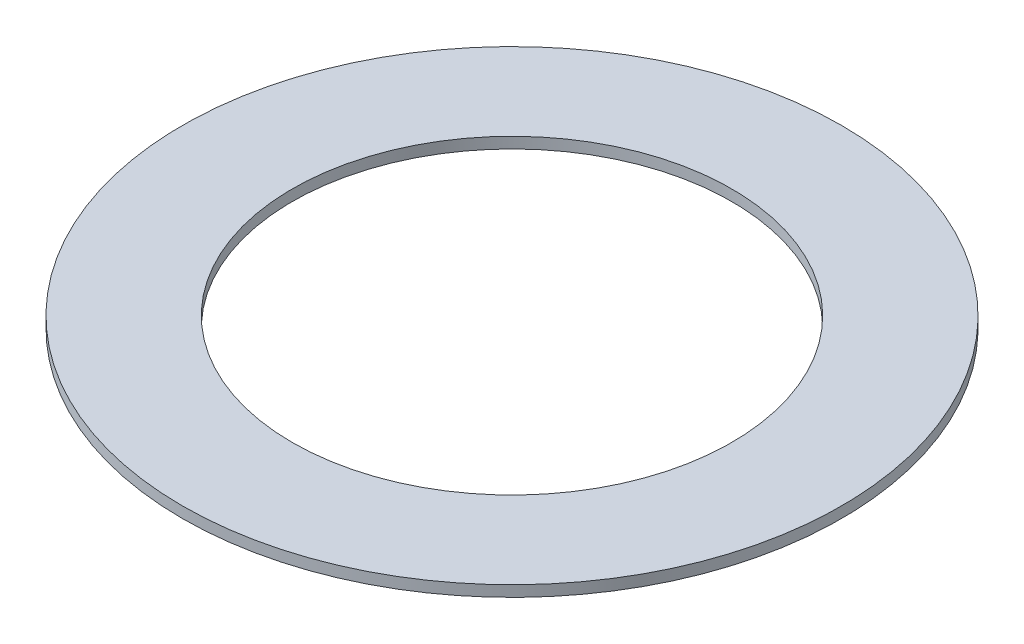
ISO-10303-21;
HEADER;
FILE_DESCRIPTION(('STEP AP214'),'2;1');
FILE_NAME('part.step','',(''),(''),'','','');
FILE_SCHEMA(('AUTOMOTIVE_DESIGN { 1 0 10303 214 1 1 1 1 }'));
ENDSEC;
DATA;
#1=APPLICATION_CONTEXT('core data for automotive mechanical design processes');
#2=APPLICATION_PROTOCOL_DEFINITION('international standard','automotive_design',2000,#1);
#3=PRODUCT_CONTEXT('',#1,'mechanical');
#4=PRODUCT('Part','Part','',(#3));
#5=PRODUCT_RELATED_PRODUCT_CATEGORY('part','',(#4));
#6=PRODUCT_DEFINITION_FORMATION('','',#4);
#7=PRODUCT_DEFINITION_CONTEXT('part definition',#1,'design');
#8=PRODUCT_DEFINITION('design','',#6,#7);
#9=PRODUCT_DEFINITION_SHAPE('','',#8);
#10=(LENGTH_UNIT() NAMED_UNIT(*) SI_UNIT(.MILLI.,.METRE.));
#11=(NAMED_UNIT(*) PLANE_ANGLE_UNIT() SI_UNIT($,.RADIAN.));
#12=(NAMED_UNIT(*) SI_UNIT($,.STERADIAN.) SOLID_ANGLE_UNIT());
#13=UNCERTAINTY_MEASURE_WITH_UNIT(LENGTH_MEASURE(1.E-05),#10,'distance_accuracy_value','');
#14=(GEOMETRIC_REPRESENTATION_CONTEXT(3) GLOBAL_UNCERTAINTY_ASSIGNED_CONTEXT((#13)) GLOBAL_UNIT_ASSIGNED_CONTEXT((#10,
#11,#12)) REPRESENTATION_CONTEXT('',''));
#15=CARTESIAN_POINT('',(0.,0.,0.));
#16=DIRECTION('',(0.,0.,1.));
#17=DIRECTION('',(1.,0.,0.));
#18=AXIS2_PLACEMENT_3D('',#15,#16,#17);
#19=CARTESIAN_POINT('',(0.,12.3438675323587,0.));
#20=DIRECTION('',(0.,1.,0.));
#21=DIRECTION('',(0.,0.,1.));
#22=AXIS2_PLACEMENT_3D('',#19,#20,#21);
#23=CYLINDRICAL_SURFACE('',#22,4.);
#24=CARTESIAN_POINT('',(0.,-0.0999999999999994,0.));
#25=DIRECTION('',(0.,1.,0.));
#26=DIRECTION('',(0.,0.,1.));
#27=AXIS2_PLACEMENT_3D('',#24,#25,#26);
#28=CIRCLE('',#27,4.);
#29=CARTESIAN_POINT('',(0.,-0.0999999999999994,4.));
#30=VERTEX_POINT('',#29);
#31=EDGE_CURVE('E10',#30,#30,#28,.T.);
#32=ORIENTED_EDGE('',*,*,#31,.F.);
#33=EDGE_LOOP('',(#32));
#34=FACE_BOUND('',#33,.T.);
#35=CARTESIAN_POINT('',(0.,0.0999999999999994,0.));
#36=DIRECTION('',(0.,1.,0.));
#37=DIRECTION('',(0.,0.,1.));
#38=AXIS2_PLACEMENT_3D('',#35,#36,#37);
#39=CIRCLE('',#38,4.);
#40=CARTESIAN_POINT('',(0.,0.0999999999999994,4.));
#41=VERTEX_POINT('',#40);
#42=EDGE_CURVE('E45',#41,#41,#39,.T.);
#43=ORIENTED_EDGE('',*,*,#42,.T.);
#44=EDGE_LOOP('',(#43));
#45=FACE_BOUND('',#44,.T.);
#46=ADVANCED_FACE('F31',(#34,#45),#23,.F.);
#47=CARTESIAN_POINT('',(0.,-0.1,-4.));
#48=DIRECTION('',(0.,1.,0.));
#49=DIRECTION('',(0.,0.,1.));
#50=AXIS2_PLACEMENT_3D('',#47,#48,#49);
#51=PLANE('',#50);
#52=CARTESIAN_POINT('',(0.,-0.0999999999999994,0.));
#53=DIRECTION('',(0.,1.,0.));
#54=DIRECTION('',(0.,0.,1.));
#55=AXIS2_PLACEMENT_3D('',#52,#53,#54);
#56=CIRCLE('',#55,6.);
#57=CARTESIAN_POINT('',(0.,-0.0999999999999994,6.));
#58=VERTEX_POINT('',#57);
#59=EDGE_CURVE('E37',#58,#58,#56,.T.);
#60=ORIENTED_EDGE('',*,*,#59,.F.);
#61=EDGE_LOOP('',(#60));
#62=FACE_BOUND('',#61,.T.);
#63=ORIENTED_EDGE('',*,*,#31,.T.);
#64=EDGE_LOOP('',(#63));
#65=FACE_BOUND('',#64,.T.);
#66=ADVANCED_FACE('F60',(#62,#65),#51,.F.);
#67=CARTESIAN_POINT('',(0.,12.3438675323587,0.));
#68=DIRECTION('',(0.,1.,0.));
#69=DIRECTION('',(0.,0.,1.));
#70=AXIS2_PLACEMENT_3D('',#67,#68,#69);
#71=CYLINDRICAL_SURFACE('',#70,6.);
#72=CARTESIAN_POINT('',(0.,0.0999999999999994,0.));
#73=DIRECTION('',(0.,1.,0.));
#74=DIRECTION('',(0.,0.,1.));
#75=AXIS2_PLACEMENT_3D('',#72,#73,#74);
#76=CIRCLE('',#75,6.);
#77=CARTESIAN_POINT('',(0.,0.0999999999999994,6.));
#78=VERTEX_POINT('',#77);
#79=EDGE_CURVE('E41',#78,#78,#76,.T.);
#80=ORIENTED_EDGE('',*,*,#79,.F.);
#81=EDGE_LOOP('',(#80));
#82=FACE_BOUND('',#81,.T.);
#83=ORIENTED_EDGE('',*,*,#59,.T.);
#84=EDGE_LOOP('',(#83));
#85=FACE_BOUND('',#84,.T.);
#86=ADVANCED_FACE('F55',(#82,#85),#71,.T.);
#87=CARTESIAN_POINT('',(0.,0.1,-4.));
#88=DIRECTION('',(0.,-1.,0.));
#89=DIRECTION('',(0.,0.,-1.));
#90=AXIS2_PLACEMENT_3D('',#87,#88,#89);
#91=PLANE('',#90);
#92=ORIENTED_EDGE('',*,*,#42,.F.);
#93=EDGE_LOOP('',(#92));
#94=FACE_BOUND('',#93,.T.);
#95=ORIENTED_EDGE('',*,*,#79,.T.);
#96=EDGE_LOOP('',(#95));
#97=FACE_BOUND('',#96,.T.);
#98=ADVANCED_FACE('F52',(#94,#97),#91,.F.);
#99=CLOSED_SHELL('',(#46,#66,#86,#98));
#100=MANIFOLD_SOLID_BREP('B2',#99);
#101=ADVANCED_BREP_SHAPE_REPRESENTATION('',(#18,#100),#14);
#102=SHAPE_DEFINITION_REPRESENTATION(#9,#101);
ENDSEC;
END-ISO-10303-21;
